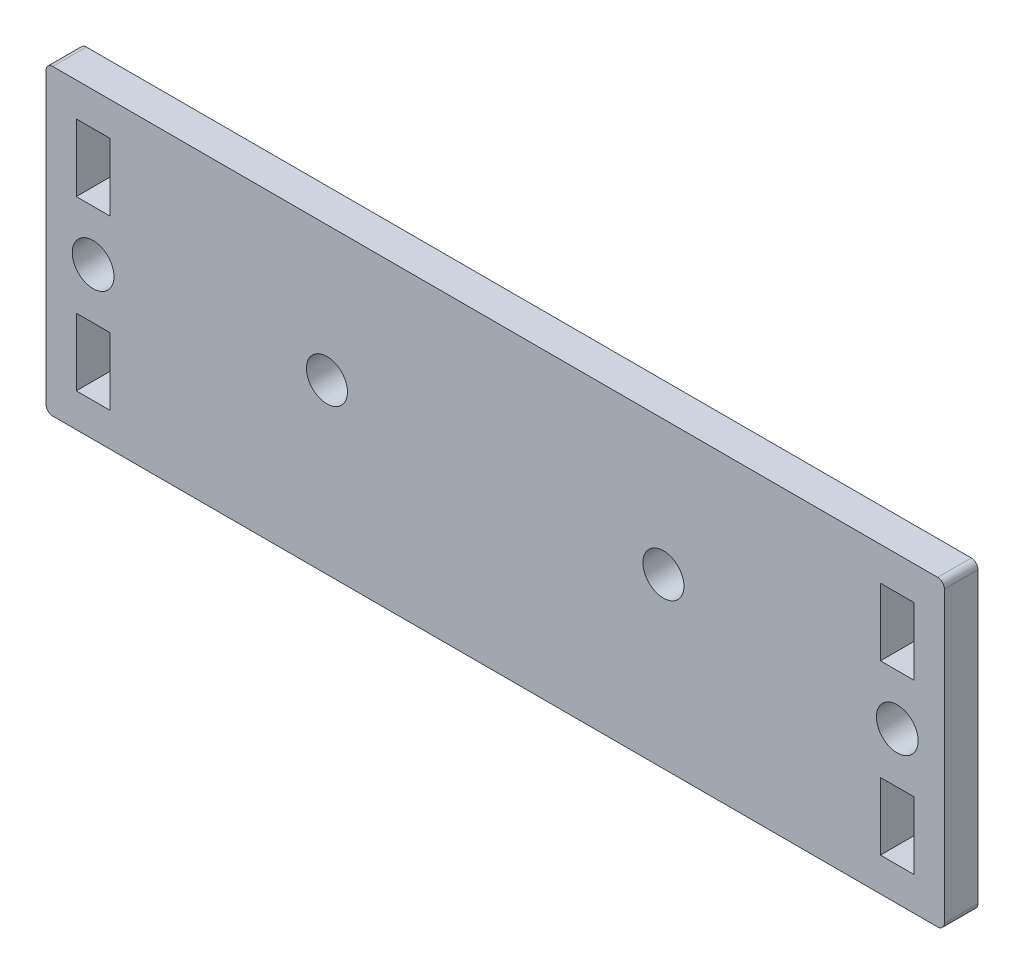
ISO-10303-21;
HEADER;
FILE_DESCRIPTION(('STEP AP214'),'2;1');
FILE_NAME('part.step','',(''),(''),'','','');
FILE_SCHEMA(('AUTOMOTIVE_DESIGN { 1 0 10303 214 1 1 1 1 }'));
ENDSEC;
DATA;
#1=APPLICATION_CONTEXT('core data for automotive mechanical design processes');
#2=APPLICATION_PROTOCOL_DEFINITION('international standard','automotive_design',2000,#1);
#3=PRODUCT_CONTEXT('',#1,'mechanical');
#4=PRODUCT('Part','Part','',(#3));
#5=PRODUCT_RELATED_PRODUCT_CATEGORY('part','',(#4));
#6=PRODUCT_DEFINITION_FORMATION('','',#4);
#7=PRODUCT_DEFINITION_CONTEXT('part definition',#1,'design');
#8=PRODUCT_DEFINITION('design','',#6,#7);
#9=PRODUCT_DEFINITION_SHAPE('','',#8);
#10=(LENGTH_UNIT() NAMED_UNIT(*) SI_UNIT(.MILLI.,.METRE.));
#11=(NAMED_UNIT(*) PLANE_ANGLE_UNIT() SI_UNIT($,.RADIAN.));
#12=(NAMED_UNIT(*) SI_UNIT($,.STERADIAN.) SOLID_ANGLE_UNIT());
#13=UNCERTAINTY_MEASURE_WITH_UNIT(LENGTH_MEASURE(1.E-05),#10,'distance_accuracy_value','');
#14=(GEOMETRIC_REPRESENTATION_CONTEXT(3) GLOBAL_UNCERTAINTY_ASSIGNED_CONTEXT((#13)) GLOBAL_UNIT_ASSIGNED_CONTEXT((#10,
#11,#12)) REPRESENTATION_CONTEXT('',''));
#15=CARTESIAN_POINT('',(0.,0.,0.));
#16=DIRECTION('',(0.,0.,1.));
#17=DIRECTION('',(1.,0.,0.));
#18=AXIS2_PLACEMENT_3D('',#15,#16,#17);
#19=CARTESIAN_POINT('',(0.,0.,5.));
#20=DIRECTION('',(0.,0.,1.));
#21=DIRECTION('',(1.,0.,0.));
#22=AXIS2_PLACEMENT_3D('',#19,#20,#21);
#23=PLANE('',#22);
#24=DIRECTION('',(-1.,0.,0.));
#25=VECTOR('',#24,1.);
#26=CARTESIAN_POINT('',(62.25,-7.49999999999998,5.));
#27=LINE('',#26,#25);
#28=CARTESIAN_POINT('',(62.25,-7.49999999999998,5.));
#29=VERTEX_POINT('',#28);
#30=CARTESIAN_POINT('',(57.25,-7.49999999999998,5.));
#31=VERTEX_POINT('',#30);
#32=EDGE_CURVE('E245',#29,#31,#27,.T.);
#33=ORIENTED_EDGE('',*,*,#32,.F.);
#34=DIRECTION('',(0.,1.,0.));
#35=VECTOR('',#34,1.);
#36=CARTESIAN_POINT('',(62.25,-7.49999999999998,5.));
#37=LINE('',#36,#35);
#38=CARTESIAN_POINT('',(62.25,-17.5,5.));
#39=VERTEX_POINT('',#38);
#40=EDGE_CURVE('E243',#39,#29,#37,.T.);
#41=ORIENTED_EDGE('',*,*,#40,.F.);
#42=DIRECTION('',(1.,0.,0.));
#43=VECTOR('',#42,1.);
#44=CARTESIAN_POINT('',(62.25,-17.5,5.));
#45=LINE('',#44,#43);
#46=CARTESIAN_POINT('',(57.25,-17.5,5.));
#47=VERTEX_POINT('',#46);
#48=EDGE_CURVE('E251',#47,#39,#45,.T.);
#49=ORIENTED_EDGE('',*,*,#48,.F.);
#50=DIRECTION('',(0.,-1.,0.));
#51=VECTOR('',#50,1.);
#52=CARTESIAN_POINT('',(57.25,-7.49999999999998,5.));
#53=LINE('',#52,#51);
#54=EDGE_CURVE('E248',#31,#47,#53,.T.);
#55=ORIENTED_EDGE('',*,*,#54,.F.);
#56=EDGE_LOOP('',(#33,#41,#49,#55));
#57=FACE_BOUND('',#56,.T.);
#58=CARTESIAN_POINT('',(-59.75,0.,5.));
#59=DIRECTION('',(0.,0.,1.));
#60=DIRECTION('',(1.,0.,0.));
#61=AXIS2_PLACEMENT_3D('',#58,#59,#60);
#62=CIRCLE('',#61,3.1);
#63=CARTESIAN_POINT('',(-56.65,0.,5.));
#64=VERTEX_POINT('',#63);
#65=EDGE_CURVE('E274',#64,#64,#62,.T.);
#66=ORIENTED_EDGE('',*,*,#65,.F.);
#67=EDGE_LOOP('',(#66));
#68=FACE_BOUND('',#67,.T.);
#69=CARTESIAN_POINT('',(25.,2.50000000000002,5.));
#70=DIRECTION('',(0.,0.,1.));
#71=DIRECTION('',(1.,0.,0.));
#72=AXIS2_PLACEMENT_3D('',#69,#70,#71);
#73=CIRCLE('',#72,3.05);
#74=CARTESIAN_POINT('',(28.05,2.50000000000002,5.));
#75=VERTEX_POINT('',#74);
#76=EDGE_CURVE('E348',#75,#75,#73,.T.);
#77=ORIENTED_EDGE('',*,*,#76,.F.);
#78=EDGE_LOOP('',(#77));
#79=FACE_BOUND('',#78,.T.);
#80=DIRECTION('',(0.,1.,0.));
#81=VECTOR('',#80,1.);
#82=CARTESIAN_POINT('',(66.75,22.5,5.));
#83=LINE('',#82,#81);
#84=CARTESIAN_POINT('',(66.75,-21.5,5.));
#85=VERTEX_POINT('',#84);
#86=CARTESIAN_POINT('',(66.75,21.5,5.));
#87=VERTEX_POINT('',#86);
#88=EDGE_CURVE('E354',#85,#87,#83,.T.);
#89=ORIENTED_EDGE('',*,*,#88,.T.);
#90=CARTESIAN_POINT('',(65.75,21.5,5.));
#91=DIRECTION('',(0.,0.,1.));
#92=DIRECTION('',(1.,0.,0.));
#93=AXIS2_PLACEMENT_3D('',#90,#91,#92);
#94=CIRCLE('',#93,1.);
#95=CARTESIAN_POINT('',(65.75,22.5,5.));
#96=VERTEX_POINT('',#95);
#97=EDGE_CURVE('E397',#87,#96,#94,.T.);
#98=ORIENTED_EDGE('',*,*,#97,.T.);
#99=DIRECTION('',(-1.,0.,0.));
#100=VECTOR('',#99,1.);
#101=CARTESIAN_POINT('',(-66.75,22.5,5.));
#102=LINE('',#101,#100);
#103=CARTESIAN_POINT('',(-65.75,22.5,5.));
#104=VERTEX_POINT('',#103);
#105=EDGE_CURVE('E357',#96,#104,#102,.T.);
#106=ORIENTED_EDGE('',*,*,#105,.T.);
#107=CARTESIAN_POINT('',(-65.75,21.5,5.));
#108=DIRECTION('',(0.,0.,1.));
#109=DIRECTION('',(1.,0.,0.));
#110=AXIS2_PLACEMENT_3D('',#107,#108,#109);
#111=CIRCLE('',#110,1.);
#112=CARTESIAN_POINT('',(-66.75,21.5,5.));
#113=VERTEX_POINT('',#112);
#114=EDGE_CURVE('E392',#104,#113,#111,.T.);
#115=ORIENTED_EDGE('',*,*,#114,.T.);
#116=DIRECTION('',(0.,-1.,0.));
#117=VECTOR('',#116,1.);
#118=CARTESIAN_POINT('',(-66.75,22.5,5.));
#119=LINE('',#118,#117);
#120=CARTESIAN_POINT('',(-66.75,-21.5,5.));
#121=VERTEX_POINT('',#120);
#122=EDGE_CURVE('E361',#113,#121,#119,.T.);
#123=ORIENTED_EDGE('',*,*,#122,.T.);
#124=CARTESIAN_POINT('',(-65.75,-21.5,5.));
#125=DIRECTION('',(0.,0.,1.));
#126=DIRECTION('',(1.,0.,0.));
#127=AXIS2_PLACEMENT_3D('',#124,#125,#126);
#128=CIRCLE('',#127,1.);
#129=CARTESIAN_POINT('',(-65.75,-22.5,5.));
#130=VERTEX_POINT('',#129);
#131=EDGE_CURVE('E55',#121,#130,#128,.T.);
#132=ORIENTED_EDGE('',*,*,#131,.T.);
#133=DIRECTION('',(1.,0.,0.));
#134=VECTOR('',#133,1.);
#135=CARTESIAN_POINT('',(-66.75,-22.5,5.));
#136=LINE('',#135,#134);
#137=CARTESIAN_POINT('',(65.75,-22.5,5.));
#138=VERTEX_POINT('',#137);
#139=EDGE_CURVE('E363',#130,#138,#136,.T.);
#140=ORIENTED_EDGE('',*,*,#139,.T.);
#141=CARTESIAN_POINT('',(65.75,-21.5,5.));
#142=DIRECTION('',(0.,0.,1.));
#143=DIRECTION('',(1.,0.,0.));
#144=AXIS2_PLACEMENT_3D('',#141,#142,#143);
#145=CIRCLE('',#144,1.);
#146=EDGE_CURVE('E395',#138,#85,#145,.T.);
#147=ORIENTED_EDGE('',*,*,#146,.T.);
#148=EDGE_LOOP('',(#89,#98,#106,#115,#123,#132,#140,#147));
#149=FACE_BOUND('',#148,.T.);
#150=CARTESIAN_POINT('',(-25.,2.50000000000002,5.));
#151=DIRECTION('',(0.,0.,1.));
#152=DIRECTION('',(-1.,0.,0.));
#153=AXIS2_PLACEMENT_3D('',#150,#151,#152);
#154=CIRCLE('',#153,3.05);
#155=CARTESIAN_POINT('',(-28.05,2.50000000000002,5.));
#156=VERTEX_POINT('',#155);
#157=EDGE_CURVE('E342',#156,#156,#154,.T.);
#158=ORIENTED_EDGE('',*,*,#157,.F.);
#159=EDGE_LOOP('',(#158));
#160=FACE_BOUND('',#159,.T.);
#161=DIRECTION('',(-1.,0.,0.));
#162=VECTOR('',#161,1.);
#163=CARTESIAN_POINT('',(-62.25,-7.5,5.));
#164=LINE('',#163,#162);
#165=CARTESIAN_POINT('',(-57.25,-7.5,5.));
#166=VERTEX_POINT('',#165);
#167=CARTESIAN_POINT('',(-62.25,-7.5,5.));
#168=VERTEX_POINT('',#167);
#169=EDGE_CURVE('E313',#166,#168,#164,.T.);
#170=ORIENTED_EDGE('',*,*,#169,.F.);
#171=DIRECTION('',(0.,1.,0.));
#172=VECTOR('',#171,1.);
#173=CARTESIAN_POINT('',(-57.25,-7.5,5.));
#174=LINE('',#173,#172);
#175=CARTESIAN_POINT('',(-57.25,-17.5,5.));
#176=VERTEX_POINT('',#175);
#177=EDGE_CURVE('E311',#176,#166,#174,.T.);
#178=ORIENTED_EDGE('',*,*,#177,.F.);
#179=DIRECTION('',(1.,0.,0.));
#180=VECTOR('',#179,1.);
#181=CARTESIAN_POINT('',(-62.25,-17.5,5.));
#182=LINE('',#181,#180);
#183=CARTESIAN_POINT('',(-62.25,-17.5,5.));
#184=VERTEX_POINT('',#183);
#185=EDGE_CURVE('E319',#184,#176,#182,.T.);
#186=ORIENTED_EDGE('',*,*,#185,.F.);
#187=DIRECTION('',(0.,-1.,0.));
#188=VECTOR('',#187,1.);
#189=CARTESIAN_POINT('',(-62.25,-7.5,5.));
#190=LINE('',#189,#188);
#191=EDGE_CURVE('E316',#168,#184,#190,.T.);
#192=ORIENTED_EDGE('',*,*,#191,.F.);
#193=EDGE_LOOP('',(#170,#178,#186,#192));
#194=FACE_BOUND('',#193,.T.);
#195=DIRECTION('',(-1.,0.,0.));
#196=VECTOR('',#195,1.);
#197=CARTESIAN_POINT('',(-62.25,17.5,5.));
#198=LINE('',#197,#196);
#199=CARTESIAN_POINT('',(-57.25,17.5,5.));
#200=VERTEX_POINT('',#199);
#201=CARTESIAN_POINT('',(-62.25,17.5,5.));
#202=VERTEX_POINT('',#201);
#203=EDGE_CURVE('E282',#200,#202,#198,.T.);
#204=ORIENTED_EDGE('',*,*,#203,.F.);
#205=DIRECTION('',(0.,1.,0.));
#206=VECTOR('',#205,1.);
#207=CARTESIAN_POINT('',(-57.25,17.5,5.));
#208=LINE('',#207,#206);
#209=CARTESIAN_POINT('',(-57.25,7.5,5.));
#210=VERTEX_POINT('',#209);
#211=EDGE_CURVE('E280',#210,#200,#208,.T.);
#212=ORIENTED_EDGE('',*,*,#211,.F.);
#213=DIRECTION('',(1.,0.,0.));
#214=VECTOR('',#213,1.);
#215=CARTESIAN_POINT('',(-62.25,7.5,5.));
#216=LINE('',#215,#214);
#217=CARTESIAN_POINT('',(-62.25,7.5,5.));
#218=VERTEX_POINT('',#217);
#219=EDGE_CURVE('E288',#218,#210,#216,.T.);
#220=ORIENTED_EDGE('',*,*,#219,.F.);
#221=DIRECTION('',(0.,-1.,0.));
#222=VECTOR('',#221,1.);
#223=CARTESIAN_POINT('',(-62.25,17.5,5.));
#224=LINE('',#223,#222);
#225=EDGE_CURVE('E285',#202,#218,#224,.T.);
#226=ORIENTED_EDGE('',*,*,#225,.F.);
#227=EDGE_LOOP('',(#204,#212,#220,#226));
#228=FACE_BOUND('',#227,.T.);
#229=CARTESIAN_POINT('',(59.75,0.,5.));
#230=DIRECTION('',(0.,0.,1.));
#231=DIRECTION('',(-1.,0.,0.));
#232=AXIS2_PLACEMENT_3D('',#229,#230,#231);
#233=CIRCLE('',#232,3.1);
#234=CARTESIAN_POINT('',(56.65,0.,5.));
#235=VERTEX_POINT('',#234);
#236=EDGE_CURVE('E237',#235,#235,#233,.T.);
#237=ORIENTED_EDGE('',*,*,#236,.F.);
#238=EDGE_LOOP('',(#237));
#239=FACE_BOUND('',#238,.T.);
#240=DIRECTION('',(-1.,0.,0.));
#241=VECTOR('',#240,1.);
#242=CARTESIAN_POINT('',(62.25,17.5,5.));
#243=LINE('',#242,#241);
#244=CARTESIAN_POINT('',(62.25,17.5,5.));
#245=VERTEX_POINT('',#244);
#246=CARTESIAN_POINT('',(57.25,17.5,5.));
#247=VERTEX_POINT('',#246);
#248=EDGE_CURVE('E206',#245,#247,#243,.T.);
#249=ORIENTED_EDGE('',*,*,#248,.F.);
#250=DIRECTION('',(0.,1.,0.));
#251=VECTOR('',#250,1.);
#252=CARTESIAN_POINT('',(62.25,17.5,5.));
#253=LINE('',#252,#251);
#254=CARTESIAN_POINT('',(62.25,7.50000000000002,5.));
#255=VERTEX_POINT('',#254);
#256=EDGE_CURVE('E196',#255,#245,#253,.T.);
#257=ORIENTED_EDGE('',*,*,#256,.F.);
#258=DIRECTION('',(1.,0.,0.));
#259=VECTOR('',#258,1.);
#260=CARTESIAN_POINT('',(62.25,7.50000000000002,5.));
#261=LINE('',#260,#259);
#262=CARTESIAN_POINT('',(57.25,7.50000000000002,5.));
#263=VERTEX_POINT('',#262);
#264=EDGE_CURVE('E221',#263,#255,#261,.T.);
#265=ORIENTED_EDGE('',*,*,#264,.F.);
#266=DIRECTION('',(0.,-1.,0.));
#267=VECTOR('',#266,1.);
#268=CARTESIAN_POINT('',(57.25,17.5,5.));
#269=LINE('',#268,#267);
#270=EDGE_CURVE('E219',#247,#263,#269,.T.);
#271=ORIENTED_EDGE('',*,*,#270,.F.);
#272=EDGE_LOOP('',(#249,#257,#265,#271));
#273=FACE_BOUND('',#272,.T.);
#274=ADVANCED_FACE('F33',(#57,#68,#79,#149,#160,#194,#228,#239,#273),#23,.T.);
#275=CARTESIAN_POINT('',(0.,0.,0.));
#276=DIRECTION('',(0.,0.,1.));
#277=DIRECTION('',(1.,0.,0.));
#278=AXIS2_PLACEMENT_3D('',#275,#276,#277);
#279=PLANE('',#278);
#280=CARTESIAN_POINT('',(59.75,0.,0.));
#281=DIRECTION('',(0.,0.,1.));
#282=DIRECTION('',(-1.,0.,0.));
#283=AXIS2_PLACEMENT_3D('',#280,#281,#282);
#284=CIRCLE('',#283,3.1);
#285=CARTESIAN_POINT('',(56.65,0.,0.));
#286=VERTEX_POINT('',#285);
#287=EDGE_CURVE('E214',#286,#286,#284,.T.);
#288=ORIENTED_EDGE('',*,*,#287,.T.);
#289=EDGE_LOOP('',(#288));
#290=FACE_BOUND('',#289,.T.);
#291=DIRECTION('',(0.,1.,0.));
#292=VECTOR('',#291,1.);
#293=CARTESIAN_POINT('',(62.25,-7.49999999999998,0.));
#294=LINE('',#293,#292);
#295=CARTESIAN_POINT('',(62.25,-17.5,0.));
#296=VERTEX_POINT('',#295);
#297=CARTESIAN_POINT('',(62.25,-7.49999999999998,0.));
#298=VERTEX_POINT('',#297);
#299=EDGE_CURVE('E240',#296,#298,#294,.T.);
#300=ORIENTED_EDGE('',*,*,#299,.T.);
#301=DIRECTION('',(-1.,0.,0.));
#302=VECTOR('',#301,1.);
#303=CARTESIAN_POINT('',(62.25,-7.49999999999998,0.));
#304=LINE('',#303,#302);
#305=CARTESIAN_POINT('',(57.25,-7.49999999999998,0.));
#306=VERTEX_POINT('',#305);
#307=EDGE_CURVE('E256',#298,#306,#304,.T.);
#308=ORIENTED_EDGE('',*,*,#307,.T.);
#309=DIRECTION('',(0.,-1.,0.));
#310=VECTOR('',#309,1.);
#311=CARTESIAN_POINT('',(57.25,-7.49999999999998,0.));
#312=LINE('',#311,#310);
#313=CARTESIAN_POINT('',(57.25,-17.5,0.));
#314=VERTEX_POINT('',#313);
#315=EDGE_CURVE('E259',#306,#314,#312,.T.);
#316=ORIENTED_EDGE('',*,*,#315,.T.);
#317=DIRECTION('',(1.,0.,0.));
#318=VECTOR('',#317,1.);
#319=CARTESIAN_POINT('',(62.25,-17.5,0.));
#320=LINE('',#319,#318);
#321=EDGE_CURVE('E246',#314,#296,#320,.T.);
#322=ORIENTED_EDGE('',*,*,#321,.T.);
#323=EDGE_LOOP('',(#300,#308,#316,#322));
#324=FACE_BOUND('',#323,.T.);
#325=DIRECTION('',(0.,1.,0.));
#326=VECTOR('',#325,1.);
#327=CARTESIAN_POINT('',(-57.25,-7.5,0.));
#328=LINE('',#327,#326);
#329=CARTESIAN_POINT('',(-57.25,-17.5,0.));
#330=VERTEX_POINT('',#329);
#331=CARTESIAN_POINT('',(-57.25,-7.5,0.));
#332=VERTEX_POINT('',#331);
#333=EDGE_CURVE('E310',#330,#332,#328,.T.);
#334=ORIENTED_EDGE('',*,*,#333,.T.);
#335=DIRECTION('',(-1.,0.,0.));
#336=VECTOR('',#335,1.);
#337=CARTESIAN_POINT('',(-62.25,-7.5,0.));
#338=LINE('',#337,#336);
#339=CARTESIAN_POINT('',(-62.25,-7.5,0.));
#340=VERTEX_POINT('',#339);
#341=EDGE_CURVE('E324',#332,#340,#338,.T.);
#342=ORIENTED_EDGE('',*,*,#341,.T.);
#343=DIRECTION('',(0.,-1.,0.));
#344=VECTOR('',#343,1.);
#345=CARTESIAN_POINT('',(-62.25,-7.5,0.));
#346=LINE('',#345,#344);
#347=CARTESIAN_POINT('',(-62.25,-17.5,0.));
#348=VERTEX_POINT('',#347);
#349=EDGE_CURVE('E327',#340,#348,#346,.T.);
#350=ORIENTED_EDGE('',*,*,#349,.T.);
#351=DIRECTION('',(1.,0.,0.));
#352=VECTOR('',#351,1.);
#353=CARTESIAN_POINT('',(-62.25,-17.5,0.));
#354=LINE('',#353,#352);
#355=EDGE_CURVE('E314',#348,#330,#354,.T.);
#356=ORIENTED_EDGE('',*,*,#355,.T.);
#357=EDGE_LOOP('',(#334,#342,#350,#356));
#358=FACE_BOUND('',#357,.T.);
#359=DIRECTION('',(-1.,0.,0.));
#360=VECTOR('',#359,1.);
#361=CARTESIAN_POINT('',(-66.75,22.5,0.));
#362=LINE('',#361,#360);
#363=CARTESIAN_POINT('',(65.75,22.5,0.));
#364=VERTEX_POINT('',#363);
#365=CARTESIAN_POINT('',(-65.75,22.5,0.));
#366=VERTEX_POINT('',#365);
#367=EDGE_CURVE('E368',#364,#366,#362,.T.);
#368=ORIENTED_EDGE('',*,*,#367,.F.);
#369=CARTESIAN_POINT('',(65.75,21.5,0.));
#370=DIRECTION('',(0.,0.,1.));
#371=DIRECTION('',(1.,0.,0.));
#372=AXIS2_PLACEMENT_3D('',#369,#370,#371);
#373=CIRCLE('',#372,1.);
#374=CARTESIAN_POINT('',(66.75,21.5,0.));
#375=VERTEX_POINT('',#374);
#376=EDGE_CURVE('E385',#364,#375,#373,.F.);
#377=ORIENTED_EDGE('',*,*,#376,.T.);
#378=DIRECTION('',(0.,1.,0.));
#379=VECTOR('',#378,1.);
#380=CARTESIAN_POINT('',(66.75,22.5,0.));
#381=LINE('',#380,#379);
#382=CARTESIAN_POINT('',(66.75,-21.5,0.));
#383=VERTEX_POINT('',#382);
#384=EDGE_CURVE('E351',#383,#375,#381,.T.);
#385=ORIENTED_EDGE('',*,*,#384,.F.);
#386=CARTESIAN_POINT('',(65.75,-21.5,0.));
#387=DIRECTION('',(0.,0.,1.));
#388=DIRECTION('',(1.,0.,0.));
#389=AXIS2_PLACEMENT_3D('',#386,#387,#388);
#390=CIRCLE('',#389,1.);
#391=CARTESIAN_POINT('',(65.75,-22.5,0.));
#392=VERTEX_POINT('',#391);
#393=EDGE_CURVE('E383',#383,#392,#390,.F.);
#394=ORIENTED_EDGE('',*,*,#393,.T.);
#395=DIRECTION('',(1.,0.,0.));
#396=VECTOR('',#395,1.);
#397=CARTESIAN_POINT('',(-66.75,-22.5,0.));
#398=LINE('',#397,#396);
#399=CARTESIAN_POINT('',(-65.75,-22.5,0.));
#400=VERTEX_POINT('',#399);
#401=EDGE_CURVE('E358',#400,#392,#398,.T.);
#402=ORIENTED_EDGE('',*,*,#401,.F.);
#403=CARTESIAN_POINT('',(-65.75,-21.5,0.));
#404=DIRECTION('',(0.,0.,1.));
#405=DIRECTION('',(1.,0.,0.));
#406=AXIS2_PLACEMENT_3D('',#403,#404,#405);
#407=CIRCLE('',#406,1.);
#408=CARTESIAN_POINT('',(-66.75,-21.5,0.));
#409=VERTEX_POINT('',#408);
#410=EDGE_CURVE('E381',#400,#409,#407,.F.);
#411=ORIENTED_EDGE('',*,*,#410,.T.);
#412=DIRECTION('',(0.,-1.,0.));
#413=VECTOR('',#412,1.);
#414=CARTESIAN_POINT('',(-66.75,22.5,0.));
#415=LINE('',#414,#413);
#416=CARTESIAN_POINT('',(-66.75,21.5,0.));
#417=VERTEX_POINT('',#416);
#418=EDGE_CURVE('E371',#417,#409,#415,.T.);
#419=ORIENTED_EDGE('',*,*,#418,.F.);
#420=CARTESIAN_POINT('',(-65.75,21.5,0.));
#421=DIRECTION('',(0.,0.,1.));
#422=DIRECTION('',(1.,0.,0.));
#423=AXIS2_PLACEMENT_3D('',#420,#421,#422);
#424=CIRCLE('',#423,1.);
#425=EDGE_CURVE('E379',#417,#366,#424,.F.);
#426=ORIENTED_EDGE('',*,*,#425,.T.);
#427=EDGE_LOOP('',(#368,#377,#385,#394,#402,#411,#419,#426));
#428=FACE_BOUND('',#427,.T.);
#429=CARTESIAN_POINT('',(25.,2.50000000000002,0.));
#430=DIRECTION('',(0.,0.,1.));
#431=DIRECTION('',(1.,0.,0.));
#432=AXIS2_PLACEMENT_3D('',#429,#430,#431);
#433=CIRCLE('',#432,3.05);
#434=CARTESIAN_POINT('',(28.05,2.50000000000002,0.));
#435=VERTEX_POINT('',#434);
#436=EDGE_CURVE('E345',#435,#435,#433,.T.);
#437=ORIENTED_EDGE('',*,*,#436,.T.);
#438=EDGE_LOOP('',(#437));
#439=FACE_BOUND('',#438,.T.);
#440=CARTESIAN_POINT('',(-25.,2.50000000000002,0.));
#441=DIRECTION('',(0.,0.,1.));
#442=DIRECTION('',(-1.,0.,0.));
#443=AXIS2_PLACEMENT_3D('',#440,#441,#442);
#444=CIRCLE('',#443,3.05);
#445=CARTESIAN_POINT('',(-28.05,2.50000000000002,0.));
#446=VERTEX_POINT('',#445);
#447=EDGE_CURVE('E341',#446,#446,#444,.T.);
#448=ORIENTED_EDGE('',*,*,#447,.T.);
#449=EDGE_LOOP('',(#448));
#450=FACE_BOUND('',#449,.T.);
#451=DIRECTION('',(0.,1.,0.));
#452=VECTOR('',#451,1.);
#453=CARTESIAN_POINT('',(-57.25,17.5,0.));
#454=LINE('',#453,#452);
#455=CARTESIAN_POINT('',(-57.25,7.5,0.));
#456=VERTEX_POINT('',#455);
#457=CARTESIAN_POINT('',(-57.25,17.5,0.));
#458=VERTEX_POINT('',#457);
#459=EDGE_CURVE('E277',#456,#458,#454,.T.);
#460=ORIENTED_EDGE('',*,*,#459,.T.);
#461=DIRECTION('',(-1.,0.,0.));
#462=VECTOR('',#461,1.);
#463=CARTESIAN_POINT('',(-62.25,17.5,0.));
#464=LINE('',#463,#462);
#465=CARTESIAN_POINT('',(-62.25,17.5,0.));
#466=VERTEX_POINT('',#465);
#467=EDGE_CURVE('E293',#458,#466,#464,.T.);
#468=ORIENTED_EDGE('',*,*,#467,.T.);
#469=DIRECTION('',(0.,-1.,0.));
#470=VECTOR('',#469,1.);
#471=CARTESIAN_POINT('',(-62.25,17.5,0.));
#472=LINE('',#471,#470);
#473=CARTESIAN_POINT('',(-62.25,7.5,0.));
#474=VERTEX_POINT('',#473);
#475=EDGE_CURVE('E296',#466,#474,#472,.T.);
#476=ORIENTED_EDGE('',*,*,#475,.T.);
#477=DIRECTION('',(1.,0.,0.));
#478=VECTOR('',#477,1.);
#479=CARTESIAN_POINT('',(-62.25,7.5,0.));
#480=LINE('',#479,#478);
#481=EDGE_CURVE('E283',#474,#456,#480,.T.);
#482=ORIENTED_EDGE('',*,*,#481,.T.);
#483=EDGE_LOOP('',(#460,#468,#476,#482));
#484=FACE_BOUND('',#483,.T.);
#485=CARTESIAN_POINT('',(-59.75,0.,0.));
#486=DIRECTION('',(0.,0.,1.));
#487=DIRECTION('',(1.,0.,0.));
#488=AXIS2_PLACEMENT_3D('',#485,#486,#487);
#489=CIRCLE('',#488,3.1);
#490=CARTESIAN_POINT('',(-56.65,0.,0.));
#491=VERTEX_POINT('',#490);
#492=EDGE_CURVE('E273',#491,#491,#489,.T.);
#493=ORIENTED_EDGE('',*,*,#492,.T.);
#494=EDGE_LOOP('',(#493));
#495=FACE_BOUND('',#494,.T.);
#496=DIRECTION('',(0.,1.,0.));
#497=VECTOR('',#496,1.);
#498=CARTESIAN_POINT('',(62.25,17.5,0.));
#499=LINE('',#498,#497);
#500=CARTESIAN_POINT('',(62.25,7.50000000000002,0.));
#501=VERTEX_POINT('',#500);
#502=CARTESIAN_POINT('',(62.25,17.5,0.));
#503=VERTEX_POINT('',#502);
#504=EDGE_CURVE('E225',#501,#503,#499,.T.);
#505=ORIENTED_EDGE('',*,*,#504,.T.);
#506=DIRECTION('',(-1.,0.,0.));
#507=VECTOR('',#506,1.);
#508=CARTESIAN_POINT('',(62.25,17.5,0.));
#509=LINE('',#508,#507);
#510=CARTESIAN_POINT('',(57.25,17.5,0.));
#511=VERTEX_POINT('',#510);
#512=EDGE_CURVE('E213',#503,#511,#509,.T.);
#513=ORIENTED_EDGE('',*,*,#512,.T.);
#514=DIRECTION('',(0.,-1.,0.));
#515=VECTOR('',#514,1.);
#516=CARTESIAN_POINT('',(57.25,17.5,0.));
#517=LINE('',#516,#515);
#518=CARTESIAN_POINT('',(57.25,7.50000000000002,0.));
#519=VERTEX_POINT('',#518);
#520=EDGE_CURVE('E228',#511,#519,#517,.T.);
#521=ORIENTED_EDGE('',*,*,#520,.T.);
#522=DIRECTION('',(1.,0.,0.));
#523=VECTOR('',#522,1.);
#524=CARTESIAN_POINT('',(62.25,7.50000000000002,0.));
#525=LINE('',#524,#523);
#526=EDGE_CURVE('E207',#519,#501,#525,.T.);
#527=ORIENTED_EDGE('',*,*,#526,.T.);
#528=EDGE_LOOP('',(#505,#513,#521,#527));
#529=FACE_BOUND('',#528,.T.);
#530=ADVANCED_FACE('F413',(#290,#324,#358,#428,#439,#450,#484,#495,#529),#279,.F.);
#531=CARTESIAN_POINT('',(66.75,22.5,5.));
#532=DIRECTION('',(-1.,0.,0.));
#533=DIRECTION('',(0.,0.,1.));
#534=AXIS2_PLACEMENT_3D('',#531,#532,#533);
#535=PLANE('',#534);
#536=ORIENTED_EDGE('',*,*,#384,.T.);
#537=DIRECTION('',(0.,0.,-1.));
#538=VECTOR('',#537,1.);
#539=CARTESIAN_POINT('',(66.75,21.5,5.));
#540=LINE('',#539,#538);
#541=EDGE_CURVE('E390',#375,#87,#540,.F.);
#542=ORIENTED_EDGE('',*,*,#541,.T.);
#543=ORIENTED_EDGE('',*,*,#88,.F.);
#544=DIRECTION('',(0.,0.,-1.));
#545=VECTOR('',#544,1.);
#546=CARTESIAN_POINT('',(66.75,-21.5,5.));
#547=LINE('',#546,#545);
#548=EDGE_CURVE('E387',#85,#383,#547,.T.);
#549=ORIENTED_EDGE('',*,*,#548,.T.);
#550=EDGE_LOOP('',(#536,#542,#543,#549));
#551=FACE_BOUND('',#550,.T.);
#552=ADVANCED_FACE('F428',(#551),#535,.F.);
#553=CARTESIAN_POINT('',(-66.75,22.5,5.));
#554=DIRECTION('',(0.,-1.,0.));
#555=DIRECTION('',(0.,0.,-1.));
#556=AXIS2_PLACEMENT_3D('',#553,#554,#555);
#557=PLANE('',#556);
#558=ORIENTED_EDGE('',*,*,#105,.F.);
#559=DIRECTION('',(0.,0.,-1.));
#560=VECTOR('',#559,1.);
#561=CARTESIAN_POINT('',(65.75,22.5,5.));
#562=LINE('',#561,#560);
#563=EDGE_CURVE('E376',#96,#364,#562,.T.);
#564=ORIENTED_EDGE('',*,*,#563,.T.);
#565=ORIENTED_EDGE('',*,*,#367,.T.);
#566=DIRECTION('',(0.,0.,-1.));
#567=VECTOR('',#566,1.);
#568=CARTESIAN_POINT('',(-65.75,22.5,5.));
#569=LINE('',#568,#567);
#570=EDGE_CURVE('E365',#366,#104,#569,.F.);
#571=ORIENTED_EDGE('',*,*,#570,.T.);
#572=EDGE_LOOP('',(#558,#564,#565,#571));
#573=FACE_BOUND('',#572,.T.);
#574=ADVANCED_FACE('F436',(#573),#557,.F.);
#575=CARTESIAN_POINT('',(-66.75,22.5,5.));
#576=DIRECTION('',(1.,0.,0.));
#577=DIRECTION('',(0.,0.,-1.));
#578=AXIS2_PLACEMENT_3D('',#575,#576,#577);
#579=PLANE('',#578);
#580=ORIENTED_EDGE('',*,*,#418,.T.);
#581=DIRECTION('',(0.,0.,-1.));
#582=VECTOR('',#581,1.);
#583=CARTESIAN_POINT('',(-66.75,-21.5,5.));
#584=LINE('',#583,#582);
#585=EDGE_CURVE('E11',#409,#121,#584,.F.);
#586=ORIENTED_EDGE('',*,*,#585,.T.);
#587=ORIENTED_EDGE('',*,*,#122,.F.);
#588=DIRECTION('',(0.,0.,-1.));
#589=VECTOR('',#588,1.);
#590=CARTESIAN_POINT('',(-66.75,21.5,5.));
#591=LINE('',#590,#589);
#592=EDGE_CURVE('E41',#113,#417,#591,.T.);
#593=ORIENTED_EDGE('',*,*,#592,.T.);
#594=EDGE_LOOP('',(#580,#586,#587,#593));
#595=FACE_BOUND('',#594,.T.);
#596=ADVANCED_FACE('F407',(#595),#579,.F.);
#597=CARTESIAN_POINT('',(-66.75,-22.5,5.));
#598=DIRECTION('',(0.,1.,0.));
#599=DIRECTION('',(0.,0.,1.));
#600=AXIS2_PLACEMENT_3D('',#597,#598,#599);
#601=PLANE('',#600);
#602=ORIENTED_EDGE('',*,*,#401,.T.);
#603=DIRECTION('',(0.,0.,-1.));
#604=VECTOR('',#603,1.);
#605=CARTESIAN_POINT('',(65.75,-22.5,5.));
#606=LINE('',#605,#604);
#607=EDGE_CURVE('E48',#392,#138,#606,.F.);
#608=ORIENTED_EDGE('',*,*,#607,.T.);
#609=ORIENTED_EDGE('',*,*,#139,.F.);
#610=DIRECTION('',(0.,0.,-1.));
#611=VECTOR('',#610,1.);
#612=CARTESIAN_POINT('',(-65.75,-22.5,5.));
#613=LINE('',#612,#611);
#614=EDGE_CURVE('E399',#130,#400,#613,.T.);
#615=ORIENTED_EDGE('',*,*,#614,.T.);
#616=EDGE_LOOP('',(#602,#608,#609,#615));
#617=FACE_BOUND('',#616,.T.);
#618=ADVANCED_FACE('F419',(#617),#601,.F.);
#619=CARTESIAN_POINT('',(25.,2.50000000000002,5.));
#620=DIRECTION('',(0.,0.,-1.));
#621=DIRECTION('',(-1.,0.,0.));
#622=AXIS2_PLACEMENT_3D('',#619,#620,#621);
#623=CYLINDRICAL_SURFACE('',#622,3.05);
#624=ORIENTED_EDGE('',*,*,#76,.T.);
#625=EDGE_LOOP('',(#624));
#626=FACE_BOUND('',#625,.T.);
#627=ORIENTED_EDGE('',*,*,#436,.F.);
#628=EDGE_LOOP('',(#627));
#629=FACE_BOUND('',#628,.T.);
#630=ADVANCED_FACE('F453',(#626,#629),#623,.F.);
#631=CARTESIAN_POINT('',(-25.,2.50000000000002,5.));
#632=DIRECTION('',(0.,0.,-1.));
#633=DIRECTION('',(-1.,0.,0.));
#634=AXIS2_PLACEMENT_3D('',#631,#632,#633);
#635=CYLINDRICAL_SURFACE('',#634,3.05);
#636=ORIENTED_EDGE('',*,*,#157,.T.);
#637=EDGE_LOOP('',(#636));
#638=FACE_BOUND('',#637,.T.);
#639=ORIENTED_EDGE('',*,*,#447,.F.);
#640=EDGE_LOOP('',(#639));
#641=FACE_BOUND('',#640,.T.);
#642=ADVANCED_FACE('F646',(#638,#641),#635,.F.);
#643=CARTESIAN_POINT('',(-57.25,-7.5,5.));
#644=DIRECTION('',(-1.,0.,0.));
#645=DIRECTION('',(0.,0.,1.));
#646=AXIS2_PLACEMENT_3D('',#643,#644,#645);
#647=PLANE('',#646);
#648=ORIENTED_EDGE('',*,*,#333,.F.);
#649=DIRECTION('',(0.,0.,-1.));
#650=VECTOR('',#649,1.);
#651=CARTESIAN_POINT('',(-57.25,-17.5,5.));
#652=LINE('',#651,#650);
#653=EDGE_CURVE('E321',#176,#330,#652,.T.);
#654=ORIENTED_EDGE('',*,*,#653,.F.);
#655=ORIENTED_EDGE('',*,*,#177,.T.);
#656=DIRECTION('',(0.,0.,-1.));
#657=VECTOR('',#656,1.);
#658=CARTESIAN_POINT('',(-57.25,-7.5,5.));
#659=LINE('',#658,#657);
#660=EDGE_CURVE('E338',#166,#332,#659,.T.);
#661=ORIENTED_EDGE('',*,*,#660,.T.);
#662=EDGE_LOOP('',(#648,#654,#655,#661));
#663=FACE_BOUND('',#662,.T.);
#664=ADVANCED_FACE('F637',(#663),#647,.T.);
#665=CARTESIAN_POINT('',(-62.25,-7.5,5.));
#666=DIRECTION('',(0.,-1.,0.));
#667=DIRECTION('',(0.,0.,-1.));
#668=AXIS2_PLACEMENT_3D('',#665,#666,#667);
#669=PLANE('',#668);
#670=ORIENTED_EDGE('',*,*,#341,.F.);
#671=ORIENTED_EDGE('',*,*,#660,.F.);
#672=ORIENTED_EDGE('',*,*,#169,.T.);
#673=DIRECTION('',(0.,0.,-1.));
#674=VECTOR('',#673,1.);
#675=CARTESIAN_POINT('',(-62.25,-7.5,5.));
#676=LINE('',#675,#674);
#677=EDGE_CURVE('E336',#168,#340,#676,.T.);
#678=ORIENTED_EDGE('',*,*,#677,.T.);
#679=EDGE_LOOP('',(#670,#671,#672,#678));
#680=FACE_BOUND('',#679,.T.);
#681=ADVANCED_FACE('F628',(#680),#669,.T.);
#682=CARTESIAN_POINT('',(-62.25,-7.5,5.));
#683=DIRECTION('',(1.,0.,0.));
#684=DIRECTION('',(0.,0.,-1.));
#685=AXIS2_PLACEMENT_3D('',#682,#683,#684);
#686=PLANE('',#685);
#687=ORIENTED_EDGE('',*,*,#349,.F.);
#688=ORIENTED_EDGE('',*,*,#677,.F.);
#689=ORIENTED_EDGE('',*,*,#191,.T.);
#690=DIRECTION('',(0.,0.,-1.));
#691=VECTOR('',#690,1.);
#692=CARTESIAN_POINT('',(-62.25,-17.5,5.));
#693=LINE('',#692,#691);
#694=EDGE_CURVE('E334',#184,#348,#693,.T.);
#695=ORIENTED_EDGE('',*,*,#694,.T.);
#696=EDGE_LOOP('',(#687,#688,#689,#695));
#697=FACE_BOUND('',#696,.T.);
#698=ADVANCED_FACE('F619',(#697),#686,.T.);
#699=CARTESIAN_POINT('',(-62.25,-17.5,5.));
#700=DIRECTION('',(0.,1.,0.));
#701=DIRECTION('',(-1.,0.,0.));
#702=AXIS2_PLACEMENT_3D('',#699,#700,#701);
#703=PLANE('',#702);
#704=ORIENTED_EDGE('',*,*,#355,.F.);
#705=ORIENTED_EDGE('',*,*,#694,.F.);
#706=ORIENTED_EDGE('',*,*,#185,.T.);
#707=ORIENTED_EDGE('',*,*,#653,.T.);
#708=EDGE_LOOP('',(#704,#705,#706,#707));
#709=FACE_BOUND('',#708,.T.);
#710=ADVANCED_FACE('F610',(#709),#703,.T.);
#711=CARTESIAN_POINT('',(-57.25,17.5,5.));
#712=DIRECTION('',(-1.,0.,0.));
#713=DIRECTION('',(0.,0.,1.));
#714=AXIS2_PLACEMENT_3D('',#711,#712,#713);
#715=PLANE('',#714);
#716=ORIENTED_EDGE('',*,*,#459,.F.);
#717=DIRECTION('',(0.,0.,-1.));
#718=VECTOR('',#717,1.);
#719=CARTESIAN_POINT('',(-57.25,7.5,5.));
#720=LINE('',#719,#718);
#721=EDGE_CURVE('E290',#210,#456,#720,.T.);
#722=ORIENTED_EDGE('',*,*,#721,.F.);
#723=ORIENTED_EDGE('',*,*,#211,.T.);
#724=DIRECTION('',(0.,0.,-1.));
#725=VECTOR('',#724,1.);
#726=CARTESIAN_POINT('',(-57.25,17.5,5.));
#727=LINE('',#726,#725);
#728=EDGE_CURVE('E307',#200,#458,#727,.T.);
#729=ORIENTED_EDGE('',*,*,#728,.T.);
#730=EDGE_LOOP('',(#716,#722,#723,#729));
#731=FACE_BOUND('',#730,.T.);
#732=ADVANCED_FACE('F601',(#731),#715,.T.);
#733=CARTESIAN_POINT('',(-62.25,17.5,5.));
#734=DIRECTION('',(0.,-1.,0.));
#735=DIRECTION('',(0.,0.,-1.));
#736=AXIS2_PLACEMENT_3D('',#733,#734,#735);
#737=PLANE('',#736);
#738=ORIENTED_EDGE('',*,*,#467,.F.);
#739=ORIENTED_EDGE('',*,*,#728,.F.);
#740=ORIENTED_EDGE('',*,*,#203,.T.);
#741=DIRECTION('',(0.,0.,-1.));
#742=VECTOR('',#741,1.);
#743=CARTESIAN_POINT('',(-62.25,17.5,5.));
#744=LINE('',#743,#742);
#745=EDGE_CURVE('E305',#202,#466,#744,.T.);
#746=ORIENTED_EDGE('',*,*,#745,.T.);
#747=EDGE_LOOP('',(#738,#739,#740,#746));
#748=FACE_BOUND('',#747,.T.);
#749=ADVANCED_FACE('F592',(#748),#737,.T.);
#750=CARTESIAN_POINT('',(-62.25,17.5,5.));
#751=DIRECTION('',(1.,0.,0.));
#752=DIRECTION('',(0.,0.,-1.));
#753=AXIS2_PLACEMENT_3D('',#750,#751,#752);
#754=PLANE('',#753);
#755=ORIENTED_EDGE('',*,*,#475,.F.);
#756=ORIENTED_EDGE('',*,*,#745,.F.);
#757=ORIENTED_EDGE('',*,*,#225,.T.);
#758=DIRECTION('',(0.,0.,-1.));
#759=VECTOR('',#758,1.);
#760=CARTESIAN_POINT('',(-62.25,7.5,5.));
#761=LINE('',#760,#759);
#762=EDGE_CURVE('E303',#218,#474,#761,.T.);
#763=ORIENTED_EDGE('',*,*,#762,.T.);
#764=EDGE_LOOP('',(#755,#756,#757,#763));
#765=FACE_BOUND('',#764,.T.);
#766=ADVANCED_FACE('F583',(#765),#754,.T.);
#767=CARTESIAN_POINT('',(-62.25,7.5,5.));
#768=DIRECTION('',(0.,1.,0.));
#769=DIRECTION('',(0.,0.,1.));
#770=AXIS2_PLACEMENT_3D('',#767,#768,#769);
#771=PLANE('',#770);
#772=ORIENTED_EDGE('',*,*,#481,.F.);
#773=ORIENTED_EDGE('',*,*,#762,.F.);
#774=ORIENTED_EDGE('',*,*,#219,.T.);
#775=ORIENTED_EDGE('',*,*,#721,.T.);
#776=EDGE_LOOP('',(#772,#773,#774,#775));
#777=FACE_BOUND('',#776,.T.);
#778=ADVANCED_FACE('F574',(#777),#771,.T.);
#779=CARTESIAN_POINT('',(-59.75,0.,5.));
#780=DIRECTION('',(0.,0.,-1.));
#781=DIRECTION('',(-1.,0.,0.));
#782=AXIS2_PLACEMENT_3D('',#779,#780,#781);
#783=CYLINDRICAL_SURFACE('',#782,3.1);
#784=ORIENTED_EDGE('',*,*,#65,.T.);
#785=EDGE_LOOP('',(#784));
#786=FACE_BOUND('',#785,.T.);
#787=ORIENTED_EDGE('',*,*,#492,.F.);
#788=EDGE_LOOP('',(#787));
#789=FACE_BOUND('',#788,.T.);
#790=ADVANCED_FACE('F565',(#786,#789),#783,.F.);
#791=CARTESIAN_POINT('',(62.25,-7.49999999999998,5.));
#792=DIRECTION('',(-1.,0.,0.));
#793=DIRECTION('',(0.,0.,1.));
#794=AXIS2_PLACEMENT_3D('',#791,#792,#793);
#795=PLANE('',#794);
#796=ORIENTED_EDGE('',*,*,#299,.F.);
#797=DIRECTION('',(0.,0.,-1.));
#798=VECTOR('',#797,1.);
#799=CARTESIAN_POINT('',(62.25,-17.5,5.));
#800=LINE('',#799,#798);
#801=EDGE_CURVE('E253',#39,#296,#800,.T.);
#802=ORIENTED_EDGE('',*,*,#801,.F.);
#803=ORIENTED_EDGE('',*,*,#40,.T.);
#804=DIRECTION('',(0.,0.,-1.));
#805=VECTOR('',#804,1.);
#806=CARTESIAN_POINT('',(62.25,-7.49999999999998,5.));
#807=LINE('',#806,#805);
#808=EDGE_CURVE('E270',#29,#298,#807,.T.);
#809=ORIENTED_EDGE('',*,*,#808,.T.);
#810=EDGE_LOOP('',(#796,#802,#803,#809));
#811=FACE_BOUND('',#810,.T.);
#812=ADVANCED_FACE('F556',(#811),#795,.T.);
#813=CARTESIAN_POINT('',(62.25,-7.49999999999998,5.));
#814=DIRECTION('',(0.,-1.,0.));
#815=DIRECTION('',(1.,0.,0.));
#816=AXIS2_PLACEMENT_3D('',#813,#814,#815);
#817=PLANE('',#816);
#818=ORIENTED_EDGE('',*,*,#307,.F.);
#819=ORIENTED_EDGE('',*,*,#808,.F.);
#820=ORIENTED_EDGE('',*,*,#32,.T.);
#821=DIRECTION('',(0.,0.,-1.));
#822=VECTOR('',#821,1.);
#823=CARTESIAN_POINT('',(57.25,-7.49999999999998,5.));
#824=LINE('',#823,#822);
#825=EDGE_CURVE('E268',#31,#306,#824,.T.);
#826=ORIENTED_EDGE('',*,*,#825,.T.);
#827=EDGE_LOOP('',(#818,#819,#820,#826));
#828=FACE_BOUND('',#827,.T.);
#829=ADVANCED_FACE('F547',(#828),#817,.T.);
#830=CARTESIAN_POINT('',(57.25,-7.49999999999998,5.));
#831=DIRECTION('',(1.,0.,0.));
#832=DIRECTION('',(0.,0.,-1.));
#833=AXIS2_PLACEMENT_3D('',#830,#831,#832);
#834=PLANE('',#833);
#835=ORIENTED_EDGE('',*,*,#315,.F.);
#836=ORIENTED_EDGE('',*,*,#825,.F.);
#837=ORIENTED_EDGE('',*,*,#54,.T.);
#838=DIRECTION('',(0.,0.,-1.));
#839=VECTOR('',#838,1.);
#840=CARTESIAN_POINT('',(57.25,-17.5,5.));
#841=LINE('',#840,#839);
#842=EDGE_CURVE('E266',#47,#314,#841,.T.);
#843=ORIENTED_EDGE('',*,*,#842,.T.);
#844=EDGE_LOOP('',(#835,#836,#837,#843));
#845=FACE_BOUND('',#844,.T.);
#846=ADVANCED_FACE('F538',(#845),#834,.T.);
#847=CARTESIAN_POINT('',(62.25,-17.5,5.));
#848=DIRECTION('',(0.,1.,0.));
#849=DIRECTION('',(-1.,0.,0.));
#850=AXIS2_PLACEMENT_3D('',#847,#848,#849);
#851=PLANE('',#850);
#852=ORIENTED_EDGE('',*,*,#321,.F.);
#853=ORIENTED_EDGE('',*,*,#842,.F.);
#854=ORIENTED_EDGE('',*,*,#48,.T.);
#855=ORIENTED_EDGE('',*,*,#801,.T.);
#856=EDGE_LOOP('',(#852,#853,#854,#855));
#857=FACE_BOUND('',#856,.T.);
#858=ADVANCED_FACE('F529',(#857),#851,.T.);
#859=CARTESIAN_POINT('',(59.75,0.,5.));
#860=DIRECTION('',(0.,0.,-1.));
#861=DIRECTION('',(-1.,0.,0.));
#862=AXIS2_PLACEMENT_3D('',#859,#860,#861);
#863=CYLINDRICAL_SURFACE('',#862,3.1);
#864=ORIENTED_EDGE('',*,*,#236,.T.);
#865=EDGE_LOOP('',(#864));
#866=FACE_BOUND('',#865,.T.);
#867=ORIENTED_EDGE('',*,*,#287,.F.);
#868=EDGE_LOOP('',(#867));
#869=FACE_BOUND('',#868,.T.);
#870=ADVANCED_FACE('F521',(#866,#869),#863,.F.);
#871=CARTESIAN_POINT('',(62.25,17.5,5.));
#872=DIRECTION('',(-1.,0.,0.));
#873=DIRECTION('',(0.,0.,1.));
#874=AXIS2_PLACEMENT_3D('',#871,#872,#873);
#875=PLANE('',#874);
#876=ORIENTED_EDGE('',*,*,#504,.F.);
#877=DIRECTION('',(0.,0.,-1.));
#878=VECTOR('',#877,1.);
#879=CARTESIAN_POINT('',(62.25,7.50000000000002,5.));
#880=LINE('',#879,#878);
#881=EDGE_CURVE('E202',#255,#501,#880,.T.);
#882=ORIENTED_EDGE('',*,*,#881,.F.);
#883=ORIENTED_EDGE('',*,*,#256,.T.);
#884=DIRECTION('',(0.,0.,-1.));
#885=VECTOR('',#884,1.);
#886=CARTESIAN_POINT('',(62.25,17.5,5.));
#887=LINE('',#886,#885);
#888=EDGE_CURVE('E199',#245,#503,#887,.T.);
#889=ORIENTED_EDGE('',*,*,#888,.T.);
#890=EDGE_LOOP('',(#876,#882,#883,#889));
#891=FACE_BOUND('',#890,.T.);
#892=ADVANCED_FACE('F198',(#891),#875,.T.);
#893=CARTESIAN_POINT('',(62.25,17.5,5.));
#894=DIRECTION('',(0.,-1.,0.));
#895=DIRECTION('',(0.,0.,-1.));
#896=AXIS2_PLACEMENT_3D('',#893,#894,#895);
#897=PLANE('',#896);
#898=ORIENTED_EDGE('',*,*,#512,.F.);
#899=ORIENTED_EDGE('',*,*,#888,.F.);
#900=ORIENTED_EDGE('',*,*,#248,.T.);
#901=DIRECTION('',(0.,0.,-1.));
#902=VECTOR('',#901,1.);
#903=CARTESIAN_POINT('',(57.25,17.5,5.));
#904=LINE('',#903,#902);
#905=EDGE_CURVE('E215',#247,#511,#904,.T.);
#906=ORIENTED_EDGE('',*,*,#905,.T.);
#907=EDGE_LOOP('',(#898,#899,#900,#906));
#908=FACE_BOUND('',#907,.T.);
#909=ADVANCED_FACE('F210',(#908),#897,.T.);
#910=CARTESIAN_POINT('',(57.25,17.5,5.));
#911=DIRECTION('',(1.,0.,0.));
#912=DIRECTION('',(0.,0.,-1.));
#913=AXIS2_PLACEMENT_3D('',#910,#911,#912);
#914=PLANE('',#913);
#915=ORIENTED_EDGE('',*,*,#520,.F.);
#916=ORIENTED_EDGE('',*,*,#905,.F.);
#917=ORIENTED_EDGE('',*,*,#270,.T.);
#918=DIRECTION('',(0.,0.,-1.));
#919=VECTOR('',#918,1.);
#920=CARTESIAN_POINT('',(57.25,7.50000000000002,5.));
#921=LINE('',#920,#919);
#922=EDGE_CURVE('E234',#263,#519,#921,.T.);
#923=ORIENTED_EDGE('',*,*,#922,.T.);
#924=EDGE_LOOP('',(#915,#916,#917,#923));
#925=FACE_BOUND('',#924,.T.);
#926=ADVANCED_FACE('F497',(#925),#914,.T.);
#927=CARTESIAN_POINT('',(62.25,7.50000000000002,5.));
#928=DIRECTION('',(0.,1.,0.));
#929=DIRECTION('',(-1.,0.,0.));
#930=AXIS2_PLACEMENT_3D('',#927,#928,#929);
#931=PLANE('',#930);
#932=ORIENTED_EDGE('',*,*,#526,.F.);
#933=ORIENTED_EDGE('',*,*,#922,.F.);
#934=ORIENTED_EDGE('',*,*,#264,.T.);
#935=ORIENTED_EDGE('',*,*,#881,.T.);
#936=EDGE_LOOP('',(#932,#933,#934,#935));
#937=FACE_BOUND('',#936,.T.);
#938=ADVANCED_FACE('F466',(#937),#931,.T.);
#939=CARTESIAN_POINT('',(65.75,21.5,5.));
#940=DIRECTION('',(0.,0.,-1.));
#941=DIRECTION('',(-1.,0.,0.));
#942=AXIS2_PLACEMENT_3D('',#939,#940,#941);
#943=CYLINDRICAL_SURFACE('',#942,1.);
#944=ORIENTED_EDGE('',*,*,#97,.F.);
#945=ORIENTED_EDGE('',*,*,#541,.F.);
#946=ORIENTED_EDGE('',*,*,#376,.F.);
#947=ORIENTED_EDGE('',*,*,#563,.F.);
#948=EDGE_LOOP('',(#944,#945,#946,#947));
#949=FACE_BOUND('',#948,.T.);
#950=ADVANCED_FACE('F433',(#949),#943,.T.);
#951=CARTESIAN_POINT('',(65.75,-21.5,5.));
#952=DIRECTION('',(0.,0.,-1.));
#953=DIRECTION('',(-1.,0.,0.));
#954=AXIS2_PLACEMENT_3D('',#951,#952,#953);
#955=CYLINDRICAL_SURFACE('',#954,1.);
#956=ORIENTED_EDGE('',*,*,#146,.F.);
#957=ORIENTED_EDGE('',*,*,#607,.F.);
#958=ORIENTED_EDGE('',*,*,#393,.F.);
#959=ORIENTED_EDGE('',*,*,#548,.F.);
#960=EDGE_LOOP('',(#956,#957,#958,#959));
#961=FACE_BOUND('',#960,.T.);
#962=ADVANCED_FACE('F425',(#961),#955,.T.);
#963=CARTESIAN_POINT('',(-65.75,-21.5,5.));
#964=DIRECTION('',(0.,0.,-1.));
#965=DIRECTION('',(-1.,0.,0.));
#966=AXIS2_PLACEMENT_3D('',#963,#964,#965);
#967=CYLINDRICAL_SURFACE('',#966,1.);
#968=ORIENTED_EDGE('',*,*,#131,.F.);
#969=ORIENTED_EDGE('',*,*,#585,.F.);
#970=ORIENTED_EDGE('',*,*,#410,.F.);
#971=ORIENTED_EDGE('',*,*,#614,.F.);
#972=EDGE_LOOP('',(#968,#969,#970,#971));
#973=FACE_BOUND('',#972,.T.);
#974=ADVANCED_FACE('F418',(#973),#967,.T.);
#975=CARTESIAN_POINT('',(-65.75,21.5,5.));
#976=DIRECTION('',(0.,0.,-1.));
#977=DIRECTION('',(-1.,0.,0.));
#978=AXIS2_PLACEMENT_3D('',#975,#976,#977);
#979=CYLINDRICAL_SURFACE('',#978,1.);
#980=ORIENTED_EDGE('',*,*,#114,.F.);
#981=ORIENTED_EDGE('',*,*,#570,.F.);
#982=ORIENTED_EDGE('',*,*,#425,.F.);
#983=ORIENTED_EDGE('',*,*,#592,.F.);
#984=EDGE_LOOP('',(#980,#981,#982,#983));
#985=FACE_BOUND('',#984,.T.);
#986=ADVANCED_FACE('F35',(#985),#979,.T.);
#987=CLOSED_SHELL('',(#274,#530,#552,#574,#596,#618,#630,#642,#664,#681,#698,#710,#732,#749,
#766,#778,#790,#812,#829,#846,#858,#870,#892,#909,#926,#938,#950,#962,#974,#986));
#988=MANIFOLD_SOLID_BREP('B2',#987);
#989=ADVANCED_BREP_SHAPE_REPRESENTATION('',(#18,#988),#14);
#990=SHAPE_DEFINITION_REPRESENTATION(#9,#989);
ENDSEC;
END-ISO-10303-21;
